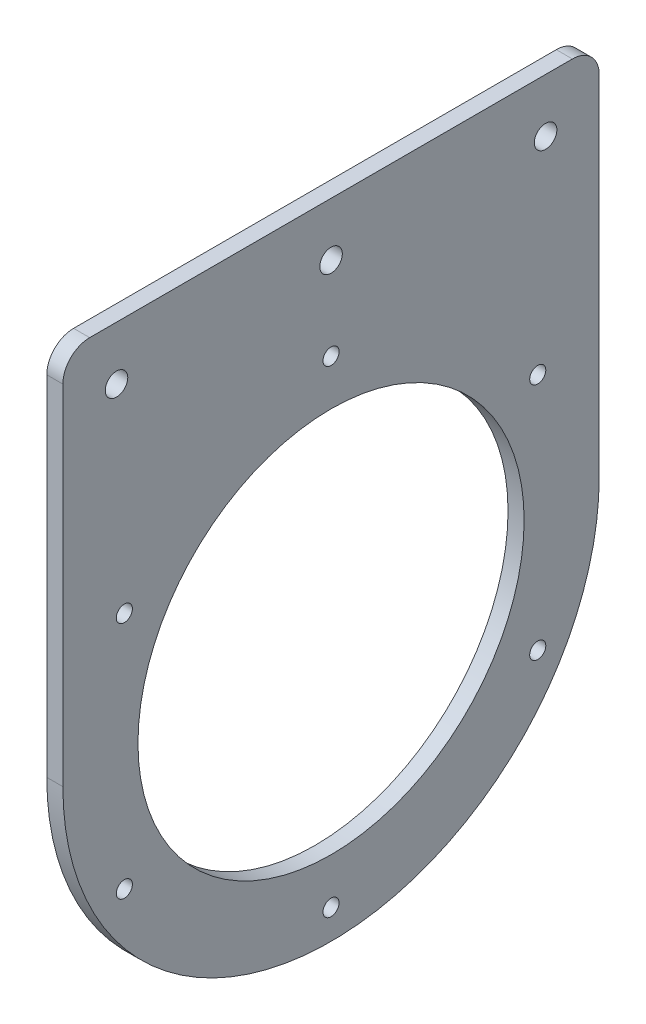
ISO-10303-21;
HEADER;
FILE_DESCRIPTION(('STEP AP214'),'2;1');
FILE_NAME('part.step','',(''),(''),'','','');
FILE_SCHEMA(('AUTOMOTIVE_DESIGN { 1 0 10303 214 1 1 1 1 }'));
ENDSEC;
DATA;
#1=APPLICATION_CONTEXT('core data for automotive mechanical design processes');
#2=APPLICATION_PROTOCOL_DEFINITION('international standard','automotive_design',2000,#1);
#3=PRODUCT_CONTEXT('',#1,'mechanical');
#4=PRODUCT('Part','Part','',(#3));
#5=PRODUCT_RELATED_PRODUCT_CATEGORY('part','',(#4));
#6=PRODUCT_DEFINITION_FORMATION('','',#4);
#7=PRODUCT_DEFINITION_CONTEXT('part definition',#1,'design');
#8=PRODUCT_DEFINITION('design','',#6,#7);
#9=PRODUCT_DEFINITION_SHAPE('','',#8);
#10=(LENGTH_UNIT() NAMED_UNIT(*) SI_UNIT(.MILLI.,.METRE.));
#11=(NAMED_UNIT(*) PLANE_ANGLE_UNIT() SI_UNIT($,.RADIAN.));
#12=(NAMED_UNIT(*) SI_UNIT($,.STERADIAN.) SOLID_ANGLE_UNIT());
#13=UNCERTAINTY_MEASURE_WITH_UNIT(LENGTH_MEASURE(1.E-05),#10,'distance_accuracy_value','');
#14=(GEOMETRIC_REPRESENTATION_CONTEXT(3) GLOBAL_UNCERTAINTY_ASSIGNED_CONTEXT((#13)) GLOBAL_UNIT_ASSIGNED_CONTEXT((#10,
#11,#12)) REPRESENTATION_CONTEXT('',''));
#15=CARTESIAN_POINT('',(0.,0.,0.));
#16=DIRECTION('',(0.,0.,1.));
#17=DIRECTION('',(1.,0.,0.));
#18=AXIS2_PLACEMENT_3D('',#15,#16,#17);
#19=CARTESIAN_POINT('',(3.,0.,0.));
#20=DIRECTION('',(1.,0.,0.));
#21=DIRECTION('',(0.,0.,-1.));
#22=AXIS2_PLACEMENT_3D('',#19,#20,#21);
#23=PLANE('',#22);
#24=CARTESIAN_POINT('',(3.,60.,40.));
#25=DIRECTION('',(1.,0.,0.));
#26=DIRECTION('',(0.,0.,-1.));
#27=AXIS2_PLACEMENT_3D('',#24,#25,#26);
#28=CIRCLE('',#27,2.1);
#29=CARTESIAN_POINT('',(3.,60.,37.9));
#30=VERTEX_POINT('',#29);
#31=EDGE_CURVE('E390',#30,#30,#28,.T.);
#32=ORIENTED_EDGE('',*,*,#31,.F.);
#33=EDGE_LOOP('',(#32));
#34=FACE_BOUND('',#33,.T.);
#35=CARTESIAN_POINT('',(3.,60.,0.));
#36=DIRECTION('',(1.,0.,0.));
#37=DIRECTION('',(0.,0.,-1.));
#38=AXIS2_PLACEMENT_3D('',#35,#36,#37);
#39=CIRCLE('',#38,2.1);
#40=CARTESIAN_POINT('',(3.,60.,-2.1));
#41=VERTEX_POINT('',#40);
#42=EDGE_CURVE('E387',#41,#41,#39,.T.);
#43=ORIENTED_EDGE('',*,*,#42,.F.);
#44=EDGE_LOOP('',(#43));
#45=FACE_BOUND('',#44,.T.);
#46=CARTESIAN_POINT('',(3.,60.,-40.));
#47=DIRECTION('',(1.,0.,0.));
#48=DIRECTION('',(0.,0.,-1.));
#49=AXIS2_PLACEMENT_3D('',#46,#47,#48);
#50=CIRCLE('',#49,2.1);
#51=CARTESIAN_POINT('',(3.,60.,-42.1));
#52=VERTEX_POINT('',#51);
#53=EDGE_CURVE('E381',#52,#52,#50,.T.);
#54=ORIENTED_EDGE('',*,*,#53,.F.);
#55=EDGE_LOOP('',(#54));
#56=FACE_BOUND('',#55,.T.);
#57=CARTESIAN_POINT('',(3.,44.5,0.));
#58=DIRECTION('',(1.,0.,0.));
#59=DIRECTION('',(0.,0.,-1.));
#60=AXIS2_PLACEMENT_3D('',#57,#58,#59);
#61=CIRCLE('',#60,1.5);
#62=CARTESIAN_POINT('',(3.,44.5,-1.5));
#63=VERTEX_POINT('',#62);
#64=EDGE_CURVE('E156',#63,#63,#61,.T.);
#65=ORIENTED_EDGE('',*,*,#64,.F.);
#66=EDGE_LOOP('',(#65));
#67=FACE_BOUND('',#66,.T.);
#68=CARTESIAN_POINT('',(3.,22.25,38.5381304684075));
#69=DIRECTION('',(1.,0.,0.));
#70=DIRECTION('',(0.,0.,-1.));
#71=AXIS2_PLACEMENT_3D('',#68,#69,#70);
#72=CIRCLE('',#71,1.5);
#73=CARTESIAN_POINT('',(3.,22.25,37.0381304684075));
#74=VERTEX_POINT('',#73);
#75=EDGE_CURVE('E353',#74,#74,#72,.T.);
#76=ORIENTED_EDGE('',*,*,#75,.F.);
#77=EDGE_LOOP('',(#76));
#78=FACE_BOUND('',#77,.T.);
#79=CARTESIAN_POINT('',(3.,-22.25,38.5381304684075));
#80=DIRECTION('',(1.,0.,0.));
#81=DIRECTION('',(0.,0.,-1.));
#82=AXIS2_PLACEMENT_3D('',#79,#80,#81);
#83=CIRCLE('',#82,1.5);
#84=CARTESIAN_POINT('',(3.,-22.25,37.0381304684075));
#85=VERTEX_POINT('',#84);
#86=EDGE_CURVE('E346',#85,#85,#83,.T.);
#87=ORIENTED_EDGE('',*,*,#86,.F.);
#88=EDGE_LOOP('',(#87));
#89=FACE_BOUND('',#88,.T.);
#90=CARTESIAN_POINT('',(3.,-44.5,0.));
#91=DIRECTION('',(1.,0.,0.));
#92=DIRECTION('',(0.,0.,-1.));
#93=AXIS2_PLACEMENT_3D('',#90,#91,#92);
#94=CIRCLE('',#93,1.5);
#95=CARTESIAN_POINT('',(3.,-44.5,-1.50000000000001));
#96=VERTEX_POINT('',#95);
#97=EDGE_CURVE('E351',#96,#96,#94,.T.);
#98=ORIENTED_EDGE('',*,*,#97,.F.);
#99=EDGE_LOOP('',(#98));
#100=FACE_BOUND('',#99,.T.);
#101=CARTESIAN_POINT('',(3.,-22.25,-38.5381304684075));
#102=DIRECTION('',(1.,0.,0.));
#103=DIRECTION('',(0.,0.,-1.));
#104=AXIS2_PLACEMENT_3D('',#101,#102,#103);
#105=CIRCLE('',#104,1.5);
#106=CARTESIAN_POINT('',(3.,-22.25,-40.0381304684075));
#107=VERTEX_POINT('',#106);
#108=EDGE_CURVE('E361',#107,#107,#105,.T.);
#109=ORIENTED_EDGE('',*,*,#108,.F.);
#110=EDGE_LOOP('',(#109));
#111=FACE_BOUND('',#110,.T.);
#112=CARTESIAN_POINT('',(3.,22.25,-38.5381304684075));
#113=DIRECTION('',(1.,0.,0.));
#114=DIRECTION('',(0.,0.,-1.));
#115=AXIS2_PLACEMENT_3D('',#112,#113,#114);
#116=CIRCLE('',#115,1.5);
#117=CARTESIAN_POINT('',(3.,22.25,-40.0381304684075));
#118=VERTEX_POINT('',#117);
#119=EDGE_CURVE('E367',#118,#118,#116,.T.);
#120=ORIENTED_EDGE('',*,*,#119,.F.);
#121=EDGE_LOOP('',(#120));
#122=FACE_BOUND('',#121,.T.);
#123=DIRECTION('',(0.,1.,0.));
#124=VECTOR('',#123,1.);
#125=CARTESIAN_POINT('',(3.,70.,-50.));
#126=LINE('',#125,#124);
#127=CARTESIAN_POINT('',(3.,0.,-50.));
#128=VERTEX_POINT('',#127);
#129=CARTESIAN_POINT('',(3.,65.,-50.));
#130=VERTEX_POINT('',#129);
#131=EDGE_CURVE('E101',#128,#130,#126,.T.);
#132=ORIENTED_EDGE('',*,*,#131,.T.);
#133=CARTESIAN_POINT('',(3.,65.,-45.));
#134=DIRECTION('',(1.,0.,0.));
#135=DIRECTION('',(0.,0.,-1.));
#136=AXIS2_PLACEMENT_3D('',#133,#134,#135);
#137=CIRCLE('',#136,5.);
#138=CARTESIAN_POINT('',(3.,70.,-45.));
#139=VERTEX_POINT('',#138);
#140=EDGE_CURVE('E133',#130,#139,#137,.T.);
#141=ORIENTED_EDGE('',*,*,#140,.T.);
#142=DIRECTION('',(0.,0.,1.));
#143=VECTOR('',#142,1.);
#144=CARTESIAN_POINT('',(3.,70.,50.));
#145=LINE('',#144,#143);
#146=CARTESIAN_POINT('',(3.,70.,45.));
#147=VERTEX_POINT('',#146);
#148=EDGE_CURVE('E146',#139,#147,#145,.T.);
#149=ORIENTED_EDGE('',*,*,#148,.T.);
#150=CARTESIAN_POINT('',(3.,65.,45.));
#151=DIRECTION('',(1.,0.,0.));
#152=DIRECTION('',(0.,0.,-1.));
#153=AXIS2_PLACEMENT_3D('',#150,#151,#152);
#154=CIRCLE('',#153,5.);
#155=CARTESIAN_POINT('',(3.,65.,50.));
#156=VERTEX_POINT('',#155);
#157=EDGE_CURVE('E131',#147,#156,#154,.T.);
#158=ORIENTED_EDGE('',*,*,#157,.T.);
#159=DIRECTION('',(0.,-1.,0.));
#160=VECTOR('',#159,1.);
#161=CARTESIAN_POINT('',(3.,0.,50.));
#162=LINE('',#161,#160);
#163=CARTESIAN_POINT('',(3.,0.,50.));
#164=VERTEX_POINT('',#163);
#165=EDGE_CURVE('E115',#156,#164,#162,.T.);
#166=ORIENTED_EDGE('',*,*,#165,.T.);
#167=CARTESIAN_POINT('',(3.,0.,0.));
#168=DIRECTION('',(1.,0.,0.));
#169=DIRECTION('',(0.,0.,-1.));
#170=AXIS2_PLACEMENT_3D('',#167,#168,#169);
#171=CIRCLE('',#170,50.);
#172=EDGE_CURVE('E120',#164,#128,#171,.T.);
#173=ORIENTED_EDGE('',*,*,#172,.T.);
#174=EDGE_LOOP('',(#132,#141,#149,#158,#166,#173));
#175=FACE_BOUND('',#174,.T.);
#176=CARTESIAN_POINT('',(3.,0.,0.));
#177=DIRECTION('',(1.,0.,0.));
#178=DIRECTION('',(0.,0.,-1.));
#179=AXIS2_PLACEMENT_3D('',#176,#177,#178);
#180=CIRCLE('',#179,36.);
#181=CARTESIAN_POINT('',(3.,0.,-36.));
#182=VERTEX_POINT('',#181);
#183=EDGE_CURVE('E121',#182,#182,#180,.T.);
#184=ORIENTED_EDGE('',*,*,#183,.F.);
#185=EDGE_LOOP('',(#184));
#186=FACE_BOUND('',#185,.T.);
#187=ADVANCED_FACE('F41',(#34,#45,#56,#67,#78,#89,#100,#111,#122,#175,#186),#23,.T.);
#188=CARTESIAN_POINT('',(0.,0.,0.));
#189=DIRECTION('',(1.,0.,0.));
#190=DIRECTION('',(0.,0.,-1.));
#191=AXIS2_PLACEMENT_3D('',#188,#189,#190);
#192=PLANE('',#191);
#193=CARTESIAN_POINT('',(0.,60.,40.));
#194=DIRECTION('',(1.,0.,0.));
#195=DIRECTION('',(0.,0.,-1.));
#196=AXIS2_PLACEMENT_3D('',#193,#194,#195);
#197=CIRCLE('',#196,2.1);
#198=CARTESIAN_POINT('',(0.,60.,37.9));
#199=VERTEX_POINT('',#198);
#200=EDGE_CURVE('E373',#199,#199,#197,.T.);
#201=ORIENTED_EDGE('',*,*,#200,.T.);
#202=EDGE_LOOP('',(#201));
#203=FACE_BOUND('',#202,.T.);
#204=CARTESIAN_POINT('',(0.,60.,0.));
#205=DIRECTION('',(1.,0.,0.));
#206=DIRECTION('',(0.,0.,-1.));
#207=AXIS2_PLACEMENT_3D('',#204,#205,#206);
#208=CIRCLE('',#207,2.1);
#209=CARTESIAN_POINT('',(0.,60.,-2.1));
#210=VERTEX_POINT('',#209);
#211=EDGE_CURVE('E384',#210,#210,#208,.T.);
#212=ORIENTED_EDGE('',*,*,#211,.T.);
#213=EDGE_LOOP('',(#212));
#214=FACE_BOUND('',#213,.T.);
#215=CARTESIAN_POINT('',(0.,60.,-40.));
#216=DIRECTION('',(1.,0.,0.));
#217=DIRECTION('',(0.,0.,-1.));
#218=AXIS2_PLACEMENT_3D('',#215,#216,#217);
#219=CIRCLE('',#218,2.1);
#220=CARTESIAN_POINT('',(0.,60.,-42.1));
#221=VERTEX_POINT('',#220);
#222=EDGE_CURVE('E378',#221,#221,#219,.T.);
#223=ORIENTED_EDGE('',*,*,#222,.T.);
#224=EDGE_LOOP('',(#223));
#225=FACE_BOUND('',#224,.T.);
#226=CARTESIAN_POINT('',(0.,44.5,0.));
#227=DIRECTION('',(1.,0.,0.));
#228=DIRECTION('',(0.,0.,-1.));
#229=AXIS2_PLACEMENT_3D('',#226,#227,#228);
#230=CIRCLE('',#229,1.5);
#231=CARTESIAN_POINT('',(0.,44.5,-1.5));
#232=VERTEX_POINT('',#231);
#233=EDGE_CURVE('E152',#232,#232,#230,.T.);
#234=ORIENTED_EDGE('',*,*,#233,.T.);
#235=EDGE_LOOP('',(#234));
#236=FACE_BOUND('',#235,.T.);
#237=CARTESIAN_POINT('',(0.,22.25,38.5381304684075));
#238=DIRECTION('',(1.,0.,0.));
#239=DIRECTION('',(0.,0.,-1.));
#240=AXIS2_PLACEMENT_3D('',#237,#238,#239);
#241=CIRCLE('',#240,1.5);
#242=CARTESIAN_POINT('',(0.,22.25,37.0381304684075));
#243=VERTEX_POINT('',#242);
#244=EDGE_CURVE('E370',#243,#243,#241,.T.);
#245=ORIENTED_EDGE('',*,*,#244,.T.);
#246=EDGE_LOOP('',(#245));
#247=FACE_BOUND('',#246,.T.);
#248=CARTESIAN_POINT('',(0.,-22.25,38.5381304684075));
#249=DIRECTION('',(1.,0.,0.));
#250=DIRECTION('',(0.,0.,-1.));
#251=AXIS2_PLACEMENT_3D('',#248,#249,#250);
#252=CIRCLE('',#251,1.5);
#253=CARTESIAN_POINT('',(0.,-22.25,37.0381304684075));
#254=VERTEX_POINT('',#253);
#255=EDGE_CURVE('E343',#254,#254,#252,.T.);
#256=ORIENTED_EDGE('',*,*,#255,.T.);
#257=EDGE_LOOP('',(#256));
#258=FACE_BOUND('',#257,.T.);
#259=CARTESIAN_POINT('',(0.,-44.5,0.));
#260=DIRECTION('',(1.,0.,0.));
#261=DIRECTION('',(0.,0.,-1.));
#262=AXIS2_PLACEMENT_3D('',#259,#260,#261);
#263=CIRCLE('',#262,1.5);
#264=CARTESIAN_POINT('',(0.,-44.5,-1.50000000000001));
#265=VERTEX_POINT('',#264);
#266=EDGE_CURVE('E348',#265,#265,#263,.T.);
#267=ORIENTED_EDGE('',*,*,#266,.T.);
#268=EDGE_LOOP('',(#267));
#269=FACE_BOUND('',#268,.T.);
#270=CARTESIAN_POINT('',(0.,-22.25,-38.5381304684075));
#271=DIRECTION('',(1.,0.,0.));
#272=DIRECTION('',(0.,0.,-1.));
#273=AXIS2_PLACEMENT_3D('',#270,#271,#272);
#274=CIRCLE('',#273,1.5);
#275=CARTESIAN_POINT('',(0.,-22.25,-40.0381304684075));
#276=VERTEX_POINT('',#275);
#277=EDGE_CURVE('E358',#276,#276,#274,.T.);
#278=ORIENTED_EDGE('',*,*,#277,.T.);
#279=EDGE_LOOP('',(#278));
#280=FACE_BOUND('',#279,.T.);
#281=CARTESIAN_POINT('',(0.,22.25,-38.5381304684075));
#282=DIRECTION('',(1.,0.,0.));
#283=DIRECTION('',(0.,0.,-1.));
#284=AXIS2_PLACEMENT_3D('',#281,#282,#283);
#285=CIRCLE('',#284,1.5);
#286=CARTESIAN_POINT('',(0.,22.25,-40.0381304684075));
#287=VERTEX_POINT('',#286);
#288=EDGE_CURVE('E364',#287,#287,#285,.T.);
#289=ORIENTED_EDGE('',*,*,#288,.T.);
#290=EDGE_LOOP('',(#289));
#291=FACE_BOUND('',#290,.T.);
#292=DIRECTION('',(0.,0.,1.));
#293=VECTOR('',#292,1.);
#294=CARTESIAN_POINT('',(0.,70.,50.));
#295=LINE('',#294,#293);
#296=CARTESIAN_POINT('',(0.,70.,-45.));
#297=VERTEX_POINT('',#296);
#298=CARTESIAN_POINT('',(0.,70.,45.));
#299=VERTEX_POINT('',#298);
#300=EDGE_CURVE('E114',#297,#299,#295,.T.);
#301=ORIENTED_EDGE('',*,*,#300,.F.);
#302=CARTESIAN_POINT('',(0.,65.,-45.));
#303=DIRECTION('',(1.,0.,0.));
#304=DIRECTION('',(0.,0.,-1.));
#305=AXIS2_PLACEMENT_3D('',#302,#303,#304);
#306=CIRCLE('',#305,5.);
#307=CARTESIAN_POINT('',(0.,65.,-50.));
#308=VERTEX_POINT('',#307);
#309=EDGE_CURVE('E49',#297,#308,#306,.F.);
#310=ORIENTED_EDGE('',*,*,#309,.T.);
#311=DIRECTION('',(0.,1.,0.));
#312=VECTOR('',#311,1.);
#313=CARTESIAN_POINT('',(0.,70.,-50.));
#314=LINE('',#313,#312);
#315=CARTESIAN_POINT('',(0.,0.,-50.));
#316=VERTEX_POINT('',#315);
#317=EDGE_CURVE('E98',#316,#308,#314,.T.);
#318=ORIENTED_EDGE('',*,*,#317,.F.);
#319=CARTESIAN_POINT('',(0.,0.,0.));
#320=DIRECTION('',(1.,0.,0.));
#321=DIRECTION('',(0.,0.,-1.));
#322=AXIS2_PLACEMENT_3D('',#319,#320,#321);
#323=CIRCLE('',#322,50.);
#324=CARTESIAN_POINT('',(0.,0.,50.));
#325=VERTEX_POINT('',#324);
#326=EDGE_CURVE('E112',#325,#316,#323,.T.);
#327=ORIENTED_EDGE('',*,*,#326,.F.);
#328=DIRECTION('',(0.,-1.,0.));
#329=VECTOR('',#328,1.);
#330=CARTESIAN_POINT('',(0.,0.,50.));
#331=LINE('',#330,#329);
#332=CARTESIAN_POINT('',(0.,65.,50.));
#333=VERTEX_POINT('',#332);
#334=EDGE_CURVE('E107',#333,#325,#331,.T.);
#335=ORIENTED_EDGE('',*,*,#334,.F.);
#336=CARTESIAN_POINT('',(0.,65.,45.));
#337=DIRECTION('',(1.,0.,0.));
#338=DIRECTION('',(0.,0.,-1.));
#339=AXIS2_PLACEMENT_3D('',#336,#337,#338);
#340=CIRCLE('',#339,5.);
#341=EDGE_CURVE('E61',#333,#299,#340,.F.);
#342=ORIENTED_EDGE('',*,*,#341,.T.);
#343=EDGE_LOOP('',(#301,#310,#318,#327,#335,#342));
#344=FACE_BOUND('',#343,.T.);
#345=CARTESIAN_POINT('',(0.,0.,0.));
#346=DIRECTION('',(1.,0.,0.));
#347=DIRECTION('',(0.,0.,-1.));
#348=AXIS2_PLACEMENT_3D('',#345,#346,#347);
#349=CIRCLE('',#348,36.);
#350=CARTESIAN_POINT('',(0.,0.,-36.));
#351=VERTEX_POINT('',#350);
#352=EDGE_CURVE('E126',#351,#351,#349,.T.);
#353=ORIENTED_EDGE('',*,*,#352,.T.);
#354=EDGE_LOOP('',(#353));
#355=FACE_BOUND('',#354,.T.);
#356=ADVANCED_FACE('F110',(#203,#214,#225,#236,#247,#258,#269,#280,#291,#344,#355),#192,.F.);
#357=CARTESIAN_POINT('',(3.,0.,0.));
#358=DIRECTION('',(-1.,0.,0.));
#359=DIRECTION('',(0.,0.,1.));
#360=AXIS2_PLACEMENT_3D('',#357,#358,#359);
#361=CYLINDRICAL_SURFACE('',#360,50.);
#362=ORIENTED_EDGE('',*,*,#172,.F.);
#363=DIRECTION('',(1.,0.,0.));
#364=VECTOR('',#363,1.);
#365=CARTESIAN_POINT('',(0.,0.,50.));
#366=LINE('',#365,#364);
#367=EDGE_CURVE('E106',#325,#164,#366,.T.);
#368=ORIENTED_EDGE('',*,*,#367,.F.);
#369=ORIENTED_EDGE('',*,*,#326,.T.);
#370=DIRECTION('',(1.,0.,0.));
#371=VECTOR('',#370,1.);
#372=CARTESIAN_POINT('',(0.,0.,-50.));
#373=LINE('',#372,#371);
#374=EDGE_CURVE('E94',#316,#128,#373,.T.);
#375=ORIENTED_EDGE('',*,*,#374,.T.);
#376=EDGE_LOOP('',(#362,#368,#369,#375));
#377=FACE_BOUND('',#376,.T.);
#378=ADVANCED_FACE('F118',(#377),#361,.T.);
#379=CARTESIAN_POINT('',(3.,0.,0.));
#380=DIRECTION('',(-1.,0.,0.));
#381=DIRECTION('',(0.,0.,1.));
#382=AXIS2_PLACEMENT_3D('',#379,#380,#381);
#383=CYLINDRICAL_SURFACE('',#382,36.);
#384=ORIENTED_EDGE('',*,*,#183,.T.);
#385=EDGE_LOOP('',(#384));
#386=FACE_BOUND('',#385,.T.);
#387=ORIENTED_EDGE('',*,*,#352,.F.);
#388=EDGE_LOOP('',(#387));
#389=FACE_BOUND('',#388,.T.);
#390=ADVANCED_FACE('F164',(#386,#389),#383,.F.);
#391=CARTESIAN_POINT('',(0.,0.,50.));
#392=DIRECTION('',(0.,0.,1.));
#393=DIRECTION('',(1.,0.,0.));
#394=AXIS2_PLACEMENT_3D('',#391,#392,#393);
#395=PLANE('',#394);
#396=ORIENTED_EDGE('',*,*,#165,.F.);
#397=DIRECTION('',(1.,0.,0.));
#398=VECTOR('',#397,1.);
#399=CARTESIAN_POINT('',(0.,65.,50.));
#400=LINE('',#399,#398);
#401=EDGE_CURVE('E11',#156,#333,#400,.F.);
#402=ORIENTED_EDGE('',*,*,#401,.T.);
#403=ORIENTED_EDGE('',*,*,#334,.T.);
#404=ORIENTED_EDGE('',*,*,#367,.T.);
#405=EDGE_LOOP('',(#396,#402,#403,#404));
#406=FACE_BOUND('',#405,.T.);
#407=ADVANCED_FACE('F166',(#406),#395,.T.);
#408=CARTESIAN_POINT('',(0.,70.,50.));
#409=DIRECTION('',(0.,1.,0.));
#410=DIRECTION('',(0.,0.,1.));
#411=AXIS2_PLACEMENT_3D('',#408,#409,#410);
#412=PLANE('',#411);
#413=ORIENTED_EDGE('',*,*,#148,.F.);
#414=DIRECTION('',(1.,0.,0.));
#415=VECTOR('',#414,1.);
#416=CARTESIAN_POINT('',(0.,70.,-45.));
#417=LINE('',#416,#415);
#418=EDGE_CURVE('E138',#139,#297,#417,.F.);
#419=ORIENTED_EDGE('',*,*,#418,.T.);
#420=ORIENTED_EDGE('',*,*,#300,.T.);
#421=DIRECTION('',(1.,0.,0.));
#422=VECTOR('',#421,1.);
#423=CARTESIAN_POINT('',(0.,70.,45.));
#424=LINE('',#423,#422);
#425=EDGE_CURVE('E135',#299,#147,#424,.T.);
#426=ORIENTED_EDGE('',*,*,#425,.T.);
#427=EDGE_LOOP('',(#413,#419,#420,#426));
#428=FACE_BOUND('',#427,.T.);
#429=ADVANCED_FACE('F143',(#428),#412,.T.);
#430=CARTESIAN_POINT('',(0.,70.,-50.));
#431=DIRECTION('',(0.,0.,-1.));
#432=DIRECTION('',(0.,1.,0.));
#433=AXIS2_PLACEMENT_3D('',#430,#431,#432);
#434=PLANE('',#433);
#435=ORIENTED_EDGE('',*,*,#317,.T.);
#436=DIRECTION('',(1.,0.,0.));
#437=VECTOR('',#436,1.);
#438=CARTESIAN_POINT('',(0.,65.,-50.));
#439=LINE('',#438,#437);
#440=EDGE_CURVE('E123',#308,#130,#439,.T.);
#441=ORIENTED_EDGE('',*,*,#440,.T.);
#442=ORIENTED_EDGE('',*,*,#131,.F.);
#443=ORIENTED_EDGE('',*,*,#374,.F.);
#444=EDGE_LOOP('',(#435,#441,#442,#443));
#445=FACE_BOUND('',#444,.T.);
#446=ADVANCED_FACE('F96',(#445),#434,.T.);
#447=CARTESIAN_POINT('',(0.,22.25,-38.5381304684075));
#448=DIRECTION('',(1.,0.,0.));
#449=DIRECTION('',(0.,0.,-1.));
#450=AXIS2_PLACEMENT_3D('',#447,#448,#449);
#451=CYLINDRICAL_SURFACE('',#450,1.5);
#452=ORIENTED_EDGE('',*,*,#288,.F.);
#453=EDGE_LOOP('',(#452));
#454=FACE_BOUND('',#453,.T.);
#455=ORIENTED_EDGE('',*,*,#119,.T.);
#456=EDGE_LOOP('',(#455));
#457=FACE_BOUND('',#456,.T.);
#458=ADVANCED_FACE('F218',(#454,#457),#451,.F.);
#459=CARTESIAN_POINT('',(0.,-22.25,-38.5381304684075));
#460=DIRECTION('',(1.,0.,0.));
#461=DIRECTION('',(0.,0.,-1.));
#462=AXIS2_PLACEMENT_3D('',#459,#460,#461);
#463=CYLINDRICAL_SURFACE('',#462,1.5);
#464=ORIENTED_EDGE('',*,*,#277,.F.);
#465=EDGE_LOOP('',(#464));
#466=FACE_BOUND('',#465,.T.);
#467=ORIENTED_EDGE('',*,*,#108,.T.);
#468=EDGE_LOOP('',(#467));
#469=FACE_BOUND('',#468,.T.);
#470=ADVANCED_FACE('F221',(#466,#469),#463,.F.);
#471=CARTESIAN_POINT('',(0.,-44.5,0.));
#472=DIRECTION('',(1.,0.,0.));
#473=DIRECTION('',(0.,0.,-1.));
#474=AXIS2_PLACEMENT_3D('',#471,#472,#473);
#475=CYLINDRICAL_SURFACE('',#474,1.5);
#476=ORIENTED_EDGE('',*,*,#266,.F.);
#477=EDGE_LOOP('',(#476));
#478=FACE_BOUND('',#477,.T.);
#479=ORIENTED_EDGE('',*,*,#97,.T.);
#480=EDGE_LOOP('',(#479));
#481=FACE_BOUND('',#480,.T.);
#482=ADVANCED_FACE('F225',(#478,#481),#475,.F.);
#483=CARTESIAN_POINT('',(0.,-22.25,38.5381304684075));
#484=DIRECTION('',(1.,0.,0.));
#485=DIRECTION('',(0.,0.,-1.));
#486=AXIS2_PLACEMENT_3D('',#483,#484,#485);
#487=CYLINDRICAL_SURFACE('',#486,1.5);
#488=ORIENTED_EDGE('',*,*,#255,.F.);
#489=EDGE_LOOP('',(#488));
#490=FACE_BOUND('',#489,.T.);
#491=ORIENTED_EDGE('',*,*,#86,.T.);
#492=EDGE_LOOP('',(#491));
#493=FACE_BOUND('',#492,.T.);
#494=ADVANCED_FACE('F216',(#490,#493),#487,.F.);
#495=CARTESIAN_POINT('',(0.,22.25,38.5381304684075));
#496=DIRECTION('',(1.,0.,0.));
#497=DIRECTION('',(0.,0.,-1.));
#498=AXIS2_PLACEMENT_3D('',#495,#496,#497);
#499=CYLINDRICAL_SURFACE('',#498,1.5);
#500=ORIENTED_EDGE('',*,*,#244,.F.);
#501=EDGE_LOOP('',(#500));
#502=FACE_BOUND('',#501,.T.);
#503=ORIENTED_EDGE('',*,*,#75,.T.);
#504=EDGE_LOOP('',(#503));
#505=FACE_BOUND('',#504,.T.);
#506=ADVANCED_FACE('F212',(#502,#505),#499,.F.);
#507=CARTESIAN_POINT('',(0.,44.5,0.));
#508=DIRECTION('',(1.,0.,0.));
#509=DIRECTION('',(0.,0.,-1.));
#510=AXIS2_PLACEMENT_3D('',#507,#508,#509);
#511=CYLINDRICAL_SURFACE('',#510,1.5);
#512=ORIENTED_EDGE('',*,*,#233,.F.);
#513=EDGE_LOOP('',(#512));
#514=FACE_BOUND('',#513,.T.);
#515=ORIENTED_EDGE('',*,*,#64,.T.);
#516=EDGE_LOOP('',(#515));
#517=FACE_BOUND('',#516,.T.);
#518=ADVANCED_FACE('F208',(#514,#517),#511,.F.);
#519=CARTESIAN_POINT('',(0.,60.,-40.));
#520=DIRECTION('',(1.,0.,0.));
#521=DIRECTION('',(0.,0.,-1.));
#522=AXIS2_PLACEMENT_3D('',#519,#520,#521);
#523=CYLINDRICAL_SURFACE('',#522,2.1);
#524=ORIENTED_EDGE('',*,*,#222,.F.);
#525=EDGE_LOOP('',(#524));
#526=FACE_BOUND('',#525,.T.);
#527=ORIENTED_EDGE('',*,*,#53,.T.);
#528=EDGE_LOOP('',(#527));
#529=FACE_BOUND('',#528,.T.);
#530=ADVANCED_FACE('F200',(#526,#529),#523,.F.);
#531=CARTESIAN_POINT('',(0.,60.,0.));
#532=DIRECTION('',(1.,0.,0.));
#533=DIRECTION('',(0.,0.,-1.));
#534=AXIS2_PLACEMENT_3D('',#531,#532,#533);
#535=CYLINDRICAL_SURFACE('',#534,2.1);
#536=ORIENTED_EDGE('',*,*,#211,.F.);
#537=EDGE_LOOP('',(#536));
#538=FACE_BOUND('',#537,.T.);
#539=ORIENTED_EDGE('',*,*,#42,.T.);
#540=EDGE_LOOP('',(#539));
#541=FACE_BOUND('',#540,.T.);
#542=ADVANCED_FACE('F194',(#538,#541),#535,.F.);
#543=CARTESIAN_POINT('',(0.,60.,40.));
#544=DIRECTION('',(1.,0.,0.));
#545=DIRECTION('',(0.,0.,-1.));
#546=AXIS2_PLACEMENT_3D('',#543,#544,#545);
#547=CYLINDRICAL_SURFACE('',#546,2.1);
#548=ORIENTED_EDGE('',*,*,#200,.F.);
#549=EDGE_LOOP('',(#548));
#550=FACE_BOUND('',#549,.T.);
#551=ORIENTED_EDGE('',*,*,#31,.T.);
#552=EDGE_LOOP('',(#551));
#553=FACE_BOUND('',#552,.T.);
#554=ADVANCED_FACE('F188',(#550,#553),#547,.F.);
#555=CARTESIAN_POINT('',(0.,65.,-45.));
#556=DIRECTION('',(1.,0.,0.));
#557=DIRECTION('',(0.,0.,-1.));
#558=AXIS2_PLACEMENT_3D('',#555,#556,#557);
#559=CYLINDRICAL_SURFACE('',#558,5.);
#560=ORIENTED_EDGE('',*,*,#309,.F.);
#561=ORIENTED_EDGE('',*,*,#418,.F.);
#562=ORIENTED_EDGE('',*,*,#140,.F.);
#563=ORIENTED_EDGE('',*,*,#440,.F.);
#564=EDGE_LOOP('',(#560,#561,#562,#563));
#565=FACE_BOUND('',#564,.T.);
#566=ADVANCED_FACE('F149',(#565),#559,.T.);
#567=CARTESIAN_POINT('',(0.,65.,45.));
#568=DIRECTION('',(1.,0.,0.));
#569=DIRECTION('',(0.,0.,-1.));
#570=AXIS2_PLACEMENT_3D('',#567,#568,#569);
#571=CYLINDRICAL_SURFACE('',#570,5.);
#572=ORIENTED_EDGE('',*,*,#341,.F.);
#573=ORIENTED_EDGE('',*,*,#401,.F.);
#574=ORIENTED_EDGE('',*,*,#157,.F.);
#575=ORIENTED_EDGE('',*,*,#425,.F.);
#576=EDGE_LOOP('',(#572,#573,#574,#575));
#577=FACE_BOUND('',#576,.T.);
#578=ADVANCED_FACE('F43',(#577),#571,.T.);
#579=CLOSED_SHELL('',(#187,#356,#378,#390,#407,#429,#446,#458,#470,#482,#494,#506,#518,#530,
#542,#554,#566,#578));
#580=MANIFOLD_SOLID_BREP('B2',#579);
#581=ADVANCED_BREP_SHAPE_REPRESENTATION('',(#18,#580),#14);
#582=SHAPE_DEFINITION_REPRESENTATION(#9,#581);
ENDSEC;
END-ISO-10303-21;
